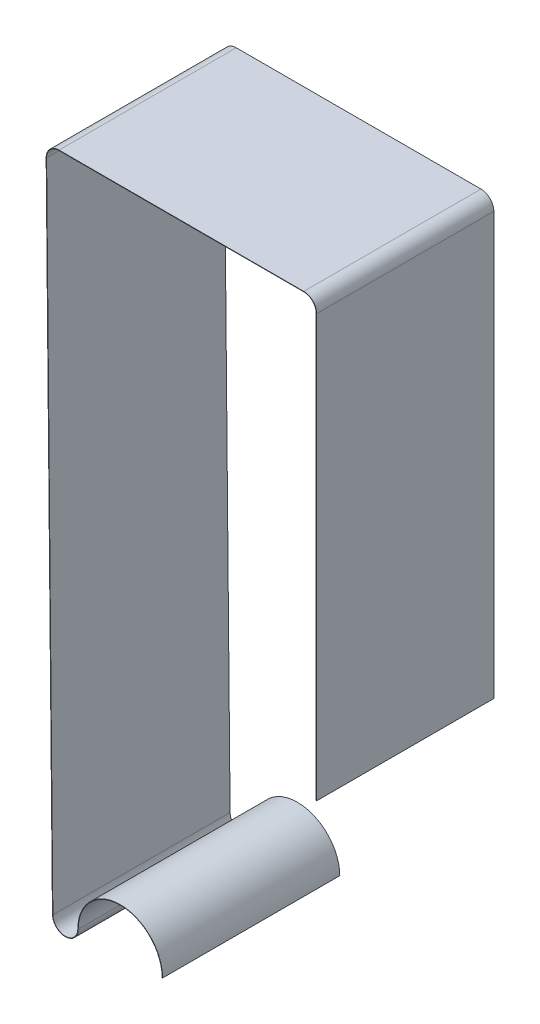
ISO-10303-21;
HEADER;
FILE_DESCRIPTION(('STEP AP214'),'2;1');
FILE_NAME('part.step','',(''),(''),'','','');
FILE_SCHEMA(('AUTOMOTIVE_DESIGN { 1 0 10303 214 1 1 1 1 }'));
ENDSEC;
DATA;
#1=APPLICATION_CONTEXT('core data for automotive mechanical design processes');
#2=APPLICATION_PROTOCOL_DEFINITION('international standard','automotive_design',2000,#1);
#3=PRODUCT_CONTEXT('',#1,'mechanical');
#4=PRODUCT('Part','Part','',(#3));
#5=PRODUCT_RELATED_PRODUCT_CATEGORY('part','',(#4));
#6=PRODUCT_DEFINITION_FORMATION('','',#4);
#7=PRODUCT_DEFINITION_CONTEXT('part definition',#1,'design');
#8=PRODUCT_DEFINITION('design','',#6,#7);
#9=PRODUCT_DEFINITION_SHAPE('','',#8);
#10=(LENGTH_UNIT() NAMED_UNIT(*) SI_UNIT(.MILLI.,.METRE.));
#11=(NAMED_UNIT(*) PLANE_ANGLE_UNIT() SI_UNIT($,.RADIAN.));
#12=(NAMED_UNIT(*) SI_UNIT($,.STERADIAN.) SOLID_ANGLE_UNIT());
#13=UNCERTAINTY_MEASURE_WITH_UNIT(LENGTH_MEASURE(1.E-05),#10,'distance_accuracy_value','');
#14=(GEOMETRIC_REPRESENTATION_CONTEXT(3) GLOBAL_UNCERTAINTY_ASSIGNED_CONTEXT((#13)) GLOBAL_UNIT_ASSIGNED_CONTEXT((#10,
#11,#12)) REPRESENTATION_CONTEXT('',''));
#15=CARTESIAN_POINT('',(0.,0.,0.));
#16=DIRECTION('',(0.,0.,1.));
#17=DIRECTION('',(1.,0.,0.));
#18=AXIS2_PLACEMENT_3D('',#15,#16,#17);
#19=CARTESIAN_POINT('',(0.,1131.07306523991,0.));
#20=DIRECTION('',(0.,-1.,0.));
#21=DIRECTION('',(0.,0.,-1.));
#22=AXIS2_PLACEMENT_3D('',#19,#20,#21);
#23=PLANE('',#22);
#24=DIRECTION('',(0.,0.,-1.));
#25=VECTOR('',#24,1.);
#26=CARTESIAN_POINT('',(5.24999999999983,1131.07306523991,105.));
#27=LINE('',#26,#25);
#28=CARTESIAN_POINT('',(5.24999999999983,1131.07306523991,105.));
#29=VERTEX_POINT('',#28);
#30=CARTESIAN_POINT('',(5.24999999999983,1131.07306523991,-105.));
#31=VERTEX_POINT('',#30);
#32=EDGE_CURVE('E180',#29,#31,#27,.T.);
#33=ORIENTED_EDGE('',*,*,#32,.F.);
#34=DIRECTION('',(1.,0.,0.));
#35=VECTOR('',#34,1.);
#36=CARTESIAN_POINT('',(4.74999999999983,1131.07306523991,105.));
#37=LINE('',#36,#35);
#38=CARTESIAN_POINT('',(4.74999999999983,1131.07306523991,105.));
#39=VERTEX_POINT('',#38);
#40=EDGE_CURVE('E182',#39,#29,#37,.T.);
#41=ORIENTED_EDGE('',*,*,#40,.F.);
#42=DIRECTION('',(0.,0.,1.));
#43=VECTOR('',#42,1.);
#44=CARTESIAN_POINT('',(4.74999999999983,1131.07306523991,105.));
#45=LINE('',#44,#43);
#46=CARTESIAN_POINT('',(4.74999999999983,1131.07306523991,-105.));
#47=VERTEX_POINT('',#46);
#48=EDGE_CURVE('E201',#47,#39,#45,.T.);
#49=ORIENTED_EDGE('',*,*,#48,.F.);
#50=DIRECTION('',(-1.,0.,0.));
#51=VECTOR('',#50,1.);
#52=CARTESIAN_POINT('',(4.74999999999983,1131.07306523991,-105.));
#53=LINE('',#52,#51);
#54=EDGE_CURVE('E185',#31,#47,#53,.T.);
#55=ORIENTED_EDGE('',*,*,#54,.F.);
#56=EDGE_LOOP('',(#33,#41,#49,#55));
#57=FACE_BOUND('',#56,.T.);
#58=ADVANCED_FACE('F47',(#57),#23,.T.);
#59=CARTESIAN_POINT('',(-172.546440075001,858.013196323219,0.));
#60=DIRECTION('',(0.,1.,0.));
#61=DIRECTION('',(0.,0.,-1.));
#62=AXIS2_PLACEMENT_3D('',#59,#60,#61);
#63=PLANE('',#62);
#64=DIRECTION('',(0.,0.,-1.));
#65=VECTOR('',#64,1.);
#66=CARTESIAN_POINT('',(-177.796440075001,858.013196323219,105.));
#67=LINE('',#66,#65);
#68=CARTESIAN_POINT('',(-177.796440075001,858.013196323219,105.));
#69=VERTEX_POINT('',#68);
#70=CARTESIAN_POINT('',(-177.796440075001,858.013196323219,-105.));
#71=VERTEX_POINT('',#70);
#72=EDGE_CURVE('E282',#69,#71,#67,.T.);
#73=ORIENTED_EDGE('',*,*,#72,.T.);
#74=DIRECTION('',(1.,0.,0.));
#75=VECTOR('',#74,1.);
#76=CARTESIAN_POINT('',(-177.296440075001,858.013196323219,-105.));
#77=LINE('',#76,#75);
#78=CARTESIAN_POINT('',(-177.296440075001,858.013196323219,-105.));
#79=VERTEX_POINT('',#78);
#80=EDGE_CURVE('E67',#71,#79,#77,.T.);
#81=ORIENTED_EDGE('',*,*,#80,.T.);
#82=DIRECTION('',(0.,0.,1.));
#83=VECTOR('',#82,1.);
#84=CARTESIAN_POINT('',(-177.296440075001,858.013196323219,105.));
#85=LINE('',#84,#83);
#86=CARTESIAN_POINT('',(-177.296440075001,858.013196323219,105.));
#87=VERTEX_POINT('',#86);
#88=EDGE_CURVE('E61',#79,#87,#85,.T.);
#89=ORIENTED_EDGE('',*,*,#88,.T.);
#90=DIRECTION('',(-1.,0.,0.));
#91=VECTOR('',#90,1.);
#92=CARTESIAN_POINT('',(-177.296440075001,858.013196323219,105.));
#93=LINE('',#92,#91);
#94=EDGE_CURVE('E11',#87,#69,#93,.T.);
#95=ORIENTED_EDGE('',*,*,#94,.T.);
#96=EDGE_LOOP('',(#73,#81,#89,#95));
#97=FACE_BOUND('',#96,.T.);
#98=ADVANCED_FACE('F456',(#97),#63,.F.);
#99=CARTESIAN_POINT('',(5.24999999999983,1131.07306523991,105.));
#100=DIRECTION('',(1.,0.,0.));
#101=DIRECTION('',(0.,1.,0.));
#102=AXIS2_PLACEMENT_3D('',#99,#100,#101);
#103=PLANE('',#102);
#104=DIRECTION('',(0.,1.,0.));
#105=VECTOR('',#104,1.);
#106=CARTESIAN_POINT('',(5.24999999999983,1131.07306523991,-105.));
#107=LINE('',#106,#105);
#108=CARTESIAN_POINT('',(5.24999999999982,1631.07306523991,-105.));
#109=VERTEX_POINT('',#108);
#110=EDGE_CURVE('E210',#31,#109,#107,.T.);
#111=ORIENTED_EDGE('',*,*,#110,.T.);
#112=DIRECTION('',(0.,0.,-1.));
#113=VECTOR('',#112,1.);
#114=CARTESIAN_POINT('',(5.24999999999982,1631.07306523991,105.));
#115=LINE('',#114,#113);
#116=CARTESIAN_POINT('',(5.24999999999982,1631.07306523991,105.));
#117=VERTEX_POINT('',#116);
#118=EDGE_CURVE('E206',#117,#109,#115,.T.);
#119=ORIENTED_EDGE('',*,*,#118,.F.);
#120=DIRECTION('',(0.,1.,0.));
#121=VECTOR('',#120,1.);
#122=CARTESIAN_POINT('',(5.24999999999983,1131.07306523991,105.));
#123=LINE('',#122,#121);
#124=EDGE_CURVE('E197',#29,#117,#123,.T.);
#125=ORIENTED_EDGE('',*,*,#124,.F.);
#126=ORIENTED_EDGE('',*,*,#32,.T.);
#127=EDGE_LOOP('',(#111,#119,#125,#126));
#128=FACE_BOUND('',#127,.T.);
#129=ADVANCED_FACE('F204',(#128),#103,.T.);
#130=CARTESIAN_POINT('',(4.74999999999983,1131.07306523991,-105.));
#131=DIRECTION('',(0.,0.,-1.));
#132=DIRECTION('',(-1.,0.,0.));
#133=AXIS2_PLACEMENT_3D('',#130,#131,#132);
#134=PLANE('',#133);
#135=DIRECTION('',(0.,1.,0.));
#136=VECTOR('',#135,1.);
#137=CARTESIAN_POINT('',(4.74999999999983,1131.07306523991,-105.));
#138=LINE('',#137,#136);
#139=CARTESIAN_POINT('',(4.74999999999982,1631.07306523991,-105.));
#140=VERTEX_POINT('',#139);
#141=EDGE_CURVE('E298',#47,#140,#138,.T.);
#142=ORIENTED_EDGE('',*,*,#141,.T.);
#143=DIRECTION('',(-1.,0.,0.));
#144=VECTOR('',#143,1.);
#145=CARTESIAN_POINT('',(4.74999999999982,1631.07306523991,-105.));
#146=LINE('',#145,#144);
#147=EDGE_CURVE('E294',#109,#140,#146,.T.);
#148=ORIENTED_EDGE('',*,*,#147,.F.);
#149=ORIENTED_EDGE('',*,*,#110,.F.);
#150=ORIENTED_EDGE('',*,*,#54,.T.);
#151=EDGE_LOOP('',(#142,#148,#149,#150));
#152=FACE_BOUND('',#151,.T.);
#153=ADVANCED_FACE('F490',(#152),#134,.T.);
#154=CARTESIAN_POINT('',(4.74999999999983,1131.07306523991,105.));
#155=DIRECTION('',(-1.,0.,0.));
#156=DIRECTION('',(0.,-1.,0.));
#157=AXIS2_PLACEMENT_3D('',#154,#155,#156);
#158=PLANE('',#157);
#159=DIRECTION('',(0.,1.,0.));
#160=VECTOR('',#159,1.);
#161=CARTESIAN_POINT('',(4.74999999999983,1131.07306523991,105.));
#162=LINE('',#161,#160);
#163=CARTESIAN_POINT('',(4.74999999999982,1631.07306523991,105.));
#164=VERTEX_POINT('',#163);
#165=EDGE_CURVE('E199',#39,#164,#162,.T.);
#166=ORIENTED_EDGE('',*,*,#165,.T.);
#167=DIRECTION('',(0.,0.,1.));
#168=VECTOR('',#167,1.);
#169=CARTESIAN_POINT('',(4.74999999999982,1631.07306523991,105.));
#170=LINE('',#169,#168);
#171=EDGE_CURVE('E302',#140,#164,#170,.T.);
#172=ORIENTED_EDGE('',*,*,#171,.F.);
#173=ORIENTED_EDGE('',*,*,#141,.F.);
#174=ORIENTED_EDGE('',*,*,#48,.T.);
#175=EDGE_LOOP('',(#166,#172,#173,#174));
#176=FACE_BOUND('',#175,.T.);
#177=ADVANCED_FACE('F435',(#176),#158,.T.);
#178=CARTESIAN_POINT('',(4.74999999999983,1131.07306523991,105.));
#179=DIRECTION('',(0.,0.,1.));
#180=DIRECTION('',(1.,0.,0.));
#181=AXIS2_PLACEMENT_3D('',#178,#179,#180);
#182=PLANE('',#181);
#183=DIRECTION('',(1.,0.,0.));
#184=VECTOR('',#183,1.);
#185=CARTESIAN_POINT('',(4.74999999999982,1631.07306523991,105.));
#186=LINE('',#185,#184);
#187=EDGE_CURVE('E227',#164,#117,#186,.T.);
#188=ORIENTED_EDGE('',*,*,#187,.F.);
#189=ORIENTED_EDGE('',*,*,#165,.F.);
#190=ORIENTED_EDGE('',*,*,#40,.T.);
#191=ORIENTED_EDGE('',*,*,#124,.T.);
#192=EDGE_LOOP('',(#188,#189,#190,#191));
#193=FACE_BOUND('',#192,.T.);
#194=ADVANCED_FACE('F196',(#193),#182,.T.);
#195=CARTESIAN_POINT('',(-10.0000000000001,1631.07306523991,0.));
#196=DIRECTION('',(0.,0.,1.));
#197=DIRECTION('',(1.,0.,0.));
#198=AXIS2_PLACEMENT_3D('',#195,#196,#197);
#199=CYLINDRICAL_SURFACE('',#198,15.2500000000167);
#200=CARTESIAN_POINT('',(-10.0000000000001,1631.07306523991,-105.));
#201=DIRECTION('',(0.,0.,1.));
#202=DIRECTION('',(1.,0.,0.));
#203=AXIS2_PLACEMENT_3D('',#200,#201,#202);
#204=CIRCLE('',#203,15.2500000000167);
#205=CARTESIAN_POINT('',(-10.0000000000002,1646.32306523992,-105.));
#206=VERTEX_POINT('',#205);
#207=EDGE_CURVE('E218',#109,#206,#204,.T.);
#208=ORIENTED_EDGE('',*,*,#207,.T.);
#209=DIRECTION('',(0.,0.,-1.));
#210=VECTOR('',#209,1.);
#211=CARTESIAN_POINT('',(-10.0000000000002,1646.32306523991,105.));
#212=LINE('',#211,#210);
#213=CARTESIAN_POINT('',(-10.0000000000002,1646.32306523992,105.));
#214=VERTEX_POINT('',#213);
#215=EDGE_CURVE('E214',#214,#206,#212,.T.);
#216=ORIENTED_EDGE('',*,*,#215,.F.);
#217=CARTESIAN_POINT('',(-10.0000000000001,1631.07306523991,105.));
#218=DIRECTION('',(0.,0.,1.));
#219=DIRECTION('',(1.,0.,0.));
#220=AXIS2_PLACEMENT_3D('',#217,#218,#219);
#221=CIRCLE('',#220,15.2500000000167);
#222=EDGE_CURVE('E219',#117,#214,#221,.T.);
#223=ORIENTED_EDGE('',*,*,#222,.F.);
#224=ORIENTED_EDGE('',*,*,#118,.T.);
#225=EDGE_LOOP('',(#208,#216,#223,#224));
#226=FACE_BOUND('',#225,.T.);
#227=ADVANCED_FACE('F431',(#226),#199,.T.);
#228=CARTESIAN_POINT('',(4.75000000001667,1631.07306523991,-105.));
#229=DIRECTION('',(0.,0.,-1.));
#230=DIRECTION('',(-1.,0.,0.));
#231=AXIS2_PLACEMENT_3D('',#228,#229,#230);
#232=PLANE('',#231);
#233=CARTESIAN_POINT('',(-10.0000000000001,1631.07306523991,-105.));
#234=DIRECTION('',(0.,0.,1.));
#235=DIRECTION('',(1.,0.,0.));
#236=AXIS2_PLACEMENT_3D('',#233,#234,#235);
#237=CIRCLE('',#236,14.7500000000167);
#238=CARTESIAN_POINT('',(-10.0000000000002,1645.82306523992,-105.));
#239=VERTEX_POINT('',#238);
#240=EDGE_CURVE('E306',#140,#239,#237,.T.);
#241=ORIENTED_EDGE('',*,*,#240,.T.);
#242=DIRECTION('',(0.,-1.,0.));
#243=VECTOR('',#242,1.);
#244=CARTESIAN_POINT('',(-10.0000000000002,1645.82306523991,-105.));
#245=LINE('',#244,#243);
#246=EDGE_CURVE('E223',#206,#239,#245,.T.);
#247=ORIENTED_EDGE('',*,*,#246,.F.);
#248=ORIENTED_EDGE('',*,*,#207,.F.);
#249=ORIENTED_EDGE('',*,*,#147,.T.);
#250=EDGE_LOOP('',(#241,#247,#248,#249));
#251=FACE_BOUND('',#250,.T.);
#252=ADVANCED_FACE('F442',(#251),#232,.T.);
#253=CARTESIAN_POINT('',(-10.0000000000001,1631.07306523991,0.));
#254=DIRECTION('',(0.,0.,1.));
#255=DIRECTION('',(1.,0.,0.));
#256=AXIS2_PLACEMENT_3D('',#253,#254,#255);
#257=CYLINDRICAL_SURFACE('',#256,14.7500000000167);
#258=CARTESIAN_POINT('',(-10.0000000000001,1631.07306523991,105.));
#259=DIRECTION('',(0.,0.,1.));
#260=DIRECTION('',(1.,0.,0.));
#261=AXIS2_PLACEMENT_3D('',#258,#259,#260);
#262=CIRCLE('',#261,14.7500000000167);
#263=CARTESIAN_POINT('',(-10.0000000000002,1645.82306523992,105.));
#264=VERTEX_POINT('',#263);
#265=EDGE_CURVE('E353',#164,#264,#262,.T.);
#266=ORIENTED_EDGE('',*,*,#265,.T.);
#267=DIRECTION('',(0.,0.,1.));
#268=VECTOR('',#267,1.);
#269=CARTESIAN_POINT('',(-10.0000000000002,1645.82306523991,105.));
#270=LINE('',#269,#268);
#271=EDGE_CURVE('E310',#239,#264,#270,.T.);
#272=ORIENTED_EDGE('',*,*,#271,.F.);
#273=ORIENTED_EDGE('',*,*,#240,.F.);
#274=ORIENTED_EDGE('',*,*,#171,.T.);
#275=EDGE_LOOP('',(#266,#272,#273,#274));
#276=FACE_BOUND('',#275,.T.);
#277=ADVANCED_FACE('F438',(#276),#257,.F.);
#278=CARTESIAN_POINT('',(4.75000000001667,1631.07306523991,105.));
#279=DIRECTION('',(0.,0.,1.));
#280=DIRECTION('',(1.,0.,0.));
#281=AXIS2_PLACEMENT_3D('',#278,#279,#280);
#282=PLANE('',#281);
#283=DIRECTION('',(0.,1.,0.));
#284=VECTOR('',#283,1.);
#285=CARTESIAN_POINT('',(-10.0000000000002,1645.82306523991,105.));
#286=LINE('',#285,#284);
#287=EDGE_CURVE('E241',#264,#214,#286,.T.);
#288=ORIENTED_EDGE('',*,*,#287,.F.);
#289=ORIENTED_EDGE('',*,*,#265,.F.);
#290=ORIENTED_EDGE('',*,*,#187,.T.);
#291=ORIENTED_EDGE('',*,*,#222,.T.);
#292=EDGE_LOOP('',(#288,#289,#290,#291));
#293=FACE_BOUND('',#292,.T.);
#294=ADVANCED_FACE('F432',(#293),#282,.T.);
#295=CARTESIAN_POINT('',(-10.0000000000002,1646.32306523991,105.));
#296=DIRECTION('',(0.,1.,0.));
#297=DIRECTION('',(-1.,0.,0.));
#298=AXIS2_PLACEMENT_3D('',#295,#296,#297);
#299=PLANE('',#298);
#300=DIRECTION('',(-1.,0.,0.));
#301=VECTOR('',#300,1.);
#302=CARTESIAN_POINT('',(-10.0000000000002,1646.32306523991,-105.));
#303=LINE('',#302,#301);
#304=CARTESIAN_POINT('',(-300.,1646.32306523991,-105.));
#305=VERTEX_POINT('',#304);
#306=EDGE_CURVE('E232',#206,#305,#303,.T.);
#307=ORIENTED_EDGE('',*,*,#306,.T.);
#308=DIRECTION('',(0.,0.,-1.));
#309=VECTOR('',#308,1.);
#310=CARTESIAN_POINT('',(-300.,1646.32306523991,105.));
#311=LINE('',#310,#309);
#312=CARTESIAN_POINT('',(-300.,1646.32306523991,105.));
#313=VERTEX_POINT('',#312);
#314=EDGE_CURVE('E228',#313,#305,#311,.T.);
#315=ORIENTED_EDGE('',*,*,#314,.F.);
#316=DIRECTION('',(-1.,0.,0.));
#317=VECTOR('',#316,1.);
#318=CARTESIAN_POINT('',(-10.0000000000002,1646.32306523991,105.));
#319=LINE('',#318,#317);
#320=EDGE_CURVE('E233',#214,#313,#319,.T.);
#321=ORIENTED_EDGE('',*,*,#320,.F.);
#322=ORIENTED_EDGE('',*,*,#215,.T.);
#323=EDGE_LOOP('',(#307,#315,#321,#322));
#324=FACE_BOUND('',#323,.T.);
#325=ADVANCED_FACE('F425',(#324),#299,.T.);
#326=CARTESIAN_POINT('',(-10.0000000000002,1645.82306523991,-105.));
#327=DIRECTION('',(0.,0.,-1.));
#328=DIRECTION('',(-1.,0.,0.));
#329=AXIS2_PLACEMENT_3D('',#326,#327,#328);
#330=PLANE('',#329);
#331=DIRECTION('',(-1.,0.,0.));
#332=VECTOR('',#331,1.);
#333=CARTESIAN_POINT('',(-10.0000000000002,1645.82306523991,-105.));
#334=LINE('',#333,#332);
#335=CARTESIAN_POINT('',(-300.,1645.82306523991,-105.));
#336=VERTEX_POINT('',#335);
#337=EDGE_CURVE('E314',#239,#336,#334,.T.);
#338=ORIENTED_EDGE('',*,*,#337,.T.);
#339=DIRECTION('',(0.,-1.,0.));
#340=VECTOR('',#339,1.);
#341=CARTESIAN_POINT('',(-300.,1645.82306523991,-105.));
#342=LINE('',#341,#340);
#343=EDGE_CURVE('E237',#305,#336,#342,.T.);
#344=ORIENTED_EDGE('',*,*,#343,.F.);
#345=ORIENTED_EDGE('',*,*,#306,.F.);
#346=ORIENTED_EDGE('',*,*,#246,.T.);
#347=EDGE_LOOP('',(#338,#344,#345,#346));
#348=FACE_BOUND('',#347,.T.);
#349=ADVANCED_FACE('F445',(#348),#330,.T.);
#350=CARTESIAN_POINT('',(-10.0000000000002,1645.82306523991,105.));
#351=DIRECTION('',(0.,-1.,0.));
#352=DIRECTION('',(1.,0.,0.));
#353=AXIS2_PLACEMENT_3D('',#350,#351,#352);
#354=PLANE('',#353);
#355=DIRECTION('',(-1.,0.,0.));
#356=VECTOR('',#355,1.);
#357=CARTESIAN_POINT('',(-10.0000000000002,1645.82306523991,105.));
#358=LINE('',#357,#356);
#359=CARTESIAN_POINT('',(-300.,1645.82306523991,105.));
#360=VERTEX_POINT('',#359);
#361=EDGE_CURVE('E360',#264,#360,#358,.T.);
#362=ORIENTED_EDGE('',*,*,#361,.T.);
#363=DIRECTION('',(0.,0.,1.));
#364=VECTOR('',#363,1.);
#365=CARTESIAN_POINT('',(-300.,1645.82306523991,105.));
#366=LINE('',#365,#364);
#367=EDGE_CURVE('E318',#336,#360,#366,.T.);
#368=ORIENTED_EDGE('',*,*,#367,.F.);
#369=ORIENTED_EDGE('',*,*,#337,.F.);
#370=ORIENTED_EDGE('',*,*,#271,.T.);
#371=EDGE_LOOP('',(#362,#368,#369,#370));
#372=FACE_BOUND('',#371,.T.);
#373=ADVANCED_FACE('F466',(#372),#354,.T.);
#374=CARTESIAN_POINT('',(-10.0000000000002,1645.82306523991,105.));
#375=DIRECTION('',(0.,0.,1.));
#376=DIRECTION('',(1.,0.,0.));
#377=AXIS2_PLACEMENT_3D('',#374,#375,#376);
#378=PLANE('',#377);
#379=DIRECTION('',(0.,1.,0.));
#380=VECTOR('',#379,1.);
#381=CARTESIAN_POINT('',(-300.,1645.82306523991,105.));
#382=LINE('',#381,#380);
#383=EDGE_CURVE('E255',#360,#313,#382,.T.);
#384=ORIENTED_EDGE('',*,*,#383,.F.);
#385=ORIENTED_EDGE('',*,*,#361,.F.);
#386=ORIENTED_EDGE('',*,*,#287,.T.);
#387=ORIENTED_EDGE('',*,*,#320,.T.);
#388=EDGE_LOOP('',(#384,#385,#386,#387));
#389=FACE_BOUND('',#388,.T.);
#390=ADVANCED_FACE('F426',(#389),#378,.T.);
#391=CARTESIAN_POINT('',(-300.,1631.07306523991,0.));
#392=DIRECTION('',(0.,0.,1.));
#393=DIRECTION('',(1.,0.,0.));
#394=AXIS2_PLACEMENT_3D('',#391,#392,#393);
#395=CYLINDRICAL_SURFACE('',#394,15.2499999999998);
#396=CARTESIAN_POINT('',(-300.,1631.07306523991,-105.));
#397=DIRECTION('',(0.,0.,1.));
#398=DIRECTION('',(0.,1.,0.));
#399=AXIS2_PLACEMENT_3D('',#396,#397,#398);
#400=CIRCLE('',#399,15.2499999999998);
#401=CARTESIAN_POINT('',(-315.249291221056,1630.92603716291,-105.));
#402=VERTEX_POINT('',#401);
#403=EDGE_CURVE('E246',#305,#402,#400,.T.);
#404=ORIENTED_EDGE('',*,*,#403,.T.);
#405=DIRECTION('',(0.,0.,-1.));
#406=VECTOR('',#405,1.);
#407=CARTESIAN_POINT('',(-315.249291221056,1630.92603716291,105.));
#408=LINE('',#407,#406);
#409=CARTESIAN_POINT('',(-315.249291221056,1630.92603716291,105.));
#410=VERTEX_POINT('',#409);
#411=EDGE_CURVE('E242',#410,#402,#408,.T.);
#412=ORIENTED_EDGE('',*,*,#411,.F.);
#413=CARTESIAN_POINT('',(-300.,1631.07306523991,105.));
#414=DIRECTION('',(0.,0.,1.));
#415=DIRECTION('',(0.,1.,0.));
#416=AXIS2_PLACEMENT_3D('',#413,#414,#415);
#417=CIRCLE('',#416,15.2499999999998);
#418=EDGE_CURVE('E247',#313,#410,#417,.T.);
#419=ORIENTED_EDGE('',*,*,#418,.F.);
#420=ORIENTED_EDGE('',*,*,#314,.T.);
#421=EDGE_LOOP('',(#404,#412,#419,#420));
#422=FACE_BOUND('',#421,.T.);
#423=ADVANCED_FACE('F419',(#422),#395,.T.);
#424=CARTESIAN_POINT('',(-300.,1645.82306523991,-105.));
#425=DIRECTION('',(0.,0.,-1.));
#426=DIRECTION('',(-1.,0.,0.));
#427=AXIS2_PLACEMENT_3D('',#424,#425,#426);
#428=PLANE('',#427);
#429=CARTESIAN_POINT('',(-300.,1631.07306523991,-105.));
#430=DIRECTION('',(0.,0.,1.));
#431=DIRECTION('',(0.,1.,0.));
#432=AXIS2_PLACEMENT_3D('',#429,#430,#431);
#433=CIRCLE('',#432,14.7499999999998);
#434=CARTESIAN_POINT('',(-314.74931445971,1630.9308577556,-105.));
#435=VERTEX_POINT('',#434);
#436=EDGE_CURVE('E322',#336,#435,#433,.T.);
#437=ORIENTED_EDGE('',*,*,#436,.T.);
#438=DIRECTION('',(0.999953522692195,0.00964118537682227,0.));
#439=VECTOR('',#438,1.);
#440=CARTESIAN_POINT('',(-314.74931445971,1630.9308577556,-105.));
#441=LINE('',#440,#439);
#442=EDGE_CURVE('E251',#402,#435,#441,.T.);
#443=ORIENTED_EDGE('',*,*,#442,.F.);
#444=ORIENTED_EDGE('',*,*,#403,.F.);
#445=ORIENTED_EDGE('',*,*,#343,.T.);
#446=EDGE_LOOP('',(#437,#443,#444,#445));
#447=FACE_BOUND('',#446,.T.);
#448=ADVANCED_FACE('F448',(#447),#428,.T.);
#449=CARTESIAN_POINT('',(-300.,1631.07306523991,0.));
#450=DIRECTION('',(0.,0.,1.));
#451=DIRECTION('',(1.,0.,0.));
#452=AXIS2_PLACEMENT_3D('',#449,#450,#451);
#453=CYLINDRICAL_SURFACE('',#452,14.7499999999998);
#454=CARTESIAN_POINT('',(-300.,1631.07306523991,105.));
#455=DIRECTION('',(0.,0.,1.));
#456=DIRECTION('',(0.,1.,0.));
#457=AXIS2_PLACEMENT_3D('',#454,#455,#456);
#458=CIRCLE('',#457,14.7499999999998);
#459=CARTESIAN_POINT('',(-314.74931445971,1630.9308577556,105.));
#460=VERTEX_POINT('',#459);
#461=EDGE_CURVE('E367',#360,#460,#458,.T.);
#462=ORIENTED_EDGE('',*,*,#461,.T.);
#463=DIRECTION('',(0.,0.,1.));
#464=VECTOR('',#463,1.);
#465=CARTESIAN_POINT('',(-314.74931445971,1630.9308577556,105.));
#466=LINE('',#465,#464);
#467=EDGE_CURVE('E326',#435,#460,#466,.T.);
#468=ORIENTED_EDGE('',*,*,#467,.F.);
#469=ORIENTED_EDGE('',*,*,#436,.F.);
#470=ORIENTED_EDGE('',*,*,#367,.T.);
#471=EDGE_LOOP('',(#462,#468,#469,#470));
#472=FACE_BOUND('',#471,.T.);
#473=ADVANCED_FACE('F463',(#472),#453,.F.);
#474=CARTESIAN_POINT('',(-300.,1645.82306523991,105.));
#475=DIRECTION('',(0.,0.,1.));
#476=DIRECTION('',(1.,0.,0.));
#477=AXIS2_PLACEMENT_3D('',#474,#475,#476);
#478=PLANE('',#477);
#479=DIRECTION('',(-0.999953522692195,-0.00964118537682227,0.));
#480=VECTOR('',#479,1.);
#481=CARTESIAN_POINT('',(-314.74931445971,1630.9308577556,105.));
#482=LINE('',#481,#480);
#483=EDGE_CURVE('E269',#460,#410,#482,.T.);
#484=ORIENTED_EDGE('',*,*,#483,.F.);
#485=ORIENTED_EDGE('',*,*,#461,.F.);
#486=ORIENTED_EDGE('',*,*,#383,.T.);
#487=ORIENTED_EDGE('',*,*,#418,.T.);
#488=EDGE_LOOP('',(#484,#485,#486,#487));
#489=FACE_BOUND('',#488,.T.);
#490=ADVANCED_FACE('F420',(#489),#478,.T.);
#491=CARTESIAN_POINT('',(-315.249291221056,1630.92603716291,105.));
#492=DIRECTION('',(-0.999953522692195,-0.0096411853768127,0.));
#493=DIRECTION('',(0.0096411853768127,-0.999953522692195,0.));
#494=AXIS2_PLACEMENT_3D('',#491,#492,#493);
#495=PLANE('',#494);
#496=DIRECTION('',(0.0096411853768127,-0.999953522692195,0.));
#497=VECTOR('',#496,1.);
#498=CARTESIAN_POINT('',(-315.249291221056,1630.92603716291,-105.));
#499=LINE('',#498,#497);
#500=CARTESIAN_POINT('',(-307.795731296057,857.866168246223,-105.));
#501=VERTEX_POINT('',#500);
#502=EDGE_CURVE('E260',#402,#501,#499,.T.);
#503=ORIENTED_EDGE('',*,*,#502,.T.);
#504=DIRECTION('',(0.,0.,-1.));
#505=VECTOR('',#504,1.);
#506=CARTESIAN_POINT('',(-307.795731296057,857.866168246223,105.));
#507=LINE('',#506,#505);
#508=CARTESIAN_POINT('',(-307.795731296057,857.866168246223,105.));
#509=VERTEX_POINT('',#508);
#510=EDGE_CURVE('E256',#509,#501,#507,.T.);
#511=ORIENTED_EDGE('',*,*,#510,.F.);
#512=DIRECTION('',(0.0096411853768127,-0.999953522692195,0.));
#513=VECTOR('',#512,1.);
#514=CARTESIAN_POINT('',(-315.249291221056,1630.92603716291,105.));
#515=LINE('',#514,#513);
#516=EDGE_CURVE('E261',#410,#509,#515,.T.);
#517=ORIENTED_EDGE('',*,*,#516,.F.);
#518=ORIENTED_EDGE('',*,*,#411,.T.);
#519=EDGE_LOOP('',(#503,#511,#517,#518));
#520=FACE_BOUND('',#519,.T.);
#521=ADVANCED_FACE('F413',(#520),#495,.T.);
#522=CARTESIAN_POINT('',(-314.74931445971,1630.9308577556,-105.));
#523=DIRECTION('',(0.,0.,-1.));
#524=DIRECTION('',(-1.,0.,0.));
#525=AXIS2_PLACEMENT_3D('',#522,#523,#524);
#526=PLANE('',#525);
#527=DIRECTION('',(0.0096411853768127,-0.999953522692195,0.));
#528=VECTOR('',#527,1.);
#529=CARTESIAN_POINT('',(-314.74931445971,1630.9308577556,-105.));
#530=LINE('',#529,#528);
#531=CARTESIAN_POINT('',(-307.295754534711,857.870988838911,-105.));
#532=VERTEX_POINT('',#531);
#533=EDGE_CURVE('E329',#435,#532,#530,.T.);
#534=ORIENTED_EDGE('',*,*,#533,.T.);
#535=DIRECTION('',(0.999953522692195,0.00964118537681269,0.));
#536=VECTOR('',#535,1.);
#537=CARTESIAN_POINT('',(-307.295754534711,857.870988838911,-105.));
#538=LINE('',#537,#536);
#539=EDGE_CURVE('E265',#501,#532,#538,.T.);
#540=ORIENTED_EDGE('',*,*,#539,.F.);
#541=ORIENTED_EDGE('',*,*,#502,.F.);
#542=ORIENTED_EDGE('',*,*,#442,.T.);
#543=EDGE_LOOP('',(#534,#540,#541,#542));
#544=FACE_BOUND('',#543,.T.);
#545=ADVANCED_FACE('F451',(#544),#526,.T.);
#546=CARTESIAN_POINT('',(-314.74931445971,1630.9308577556,105.));
#547=DIRECTION('',(0.999953522692195,0.0096411853768127,0.));
#548=DIRECTION('',(-0.0096411853768127,0.999953522692195,0.));
#549=AXIS2_PLACEMENT_3D('',#546,#547,#548);
#550=PLANE('',#549);
#551=DIRECTION('',(0.0096411853768127,-0.999953522692195,0.));
#552=VECTOR('',#551,1.);
#553=CARTESIAN_POINT('',(-314.74931445971,1630.9308577556,105.));
#554=LINE('',#553,#552);
#555=CARTESIAN_POINT('',(-307.295754534711,857.870988838911,105.));
#556=VERTEX_POINT('',#555);
#557=EDGE_CURVE('E373',#460,#556,#554,.T.);
#558=ORIENTED_EDGE('',*,*,#557,.T.);
#559=DIRECTION('',(0.,0.,1.));
#560=VECTOR('',#559,1.);
#561=CARTESIAN_POINT('',(-307.295754534711,857.870988838911,105.));
#562=LINE('',#561,#560);
#563=EDGE_CURVE('E333',#532,#556,#562,.T.);
#564=ORIENTED_EDGE('',*,*,#563,.F.);
#565=ORIENTED_EDGE('',*,*,#533,.F.);
#566=ORIENTED_EDGE('',*,*,#467,.T.);
#567=EDGE_LOOP('',(#558,#564,#565,#566));
#568=FACE_BOUND('',#567,.T.);
#569=ADVANCED_FACE('F460',(#568),#550,.T.);
#570=CARTESIAN_POINT('',(-314.74931445971,1630.9308577556,105.));
#571=DIRECTION('',(0.,0.,1.));
#572=DIRECTION('',(1.,0.,0.));
#573=AXIS2_PLACEMENT_3D('',#570,#571,#572);
#574=PLANE('',#573);
#575=DIRECTION('',(-0.999953522692195,-0.00964118537681269,0.));
#576=VECTOR('',#575,1.);
#577=CARTESIAN_POINT('',(-307.295754534711,857.870988838911,105.));
#578=LINE('',#577,#576);
#579=EDGE_CURVE('E281',#556,#509,#578,.T.);
#580=ORIENTED_EDGE('',*,*,#579,.F.);
#581=ORIENTED_EDGE('',*,*,#557,.F.);
#582=ORIENTED_EDGE('',*,*,#483,.T.);
#583=ORIENTED_EDGE('',*,*,#516,.T.);
#584=EDGE_LOOP('',(#580,#581,#582,#583));
#585=FACE_BOUND('',#584,.T.);
#586=ADVANCED_FACE('F414',(#585),#574,.T.);
#587=CARTESIAN_POINT('',(-292.546440075001,858.013196323219,0.));
#588=DIRECTION('',(0.,0.,1.));
#589=DIRECTION('',(1.,0.,0.));
#590=AXIS2_PLACEMENT_3D('',#587,#588,#589);
#591=CYLINDRICAL_SURFACE('',#590,15.25);
#592=CARTESIAN_POINT('',(-292.546440075001,858.013196323219,-105.));
#593=DIRECTION('',(0.,0.,1.));
#594=DIRECTION('',(-0.999953522692195,-0.00964118537682783,0.));
#595=AXIS2_PLACEMENT_3D('',#592,#593,#594);
#596=CIRCLE('',#595,15.25);
#597=CARTESIAN_POINT('',(-277.296440075001,858.013196323219,-105.));
#598=VERTEX_POINT('',#597);
#599=EDGE_CURVE('E153',#501,#598,#596,.T.);
#600=ORIENTED_EDGE('',*,*,#599,.T.);
#601=DIRECTION('',(0.,0.,-1.));
#602=VECTOR('',#601,1.);
#603=CARTESIAN_POINT('',(-277.296440075001,858.013196323219,105.));
#604=LINE('',#603,#602);
#605=CARTESIAN_POINT('',(-277.296440075001,858.013196323219,105.));
#606=VERTEX_POINT('',#605);
#607=EDGE_CURVE('E270',#606,#598,#604,.T.);
#608=ORIENTED_EDGE('',*,*,#607,.F.);
#609=CARTESIAN_POINT('',(-292.546440075001,858.013196323219,105.));
#610=DIRECTION('',(0.,0.,1.));
#611=DIRECTION('',(-0.999953522692195,-0.00964118537682783,0.));
#612=AXIS2_PLACEMENT_3D('',#609,#610,#611);
#613=CIRCLE('',#612,15.25);
#614=EDGE_CURVE('E274',#509,#606,#613,.T.);
#615=ORIENTED_EDGE('',*,*,#614,.F.);
#616=ORIENTED_EDGE('',*,*,#510,.T.);
#617=EDGE_LOOP('',(#600,#608,#615,#616));
#618=FACE_BOUND('',#617,.T.);
#619=ADVANCED_FACE('F406',(#618),#591,.T.);
#620=CARTESIAN_POINT('',(-307.295754534711,857.87098883891,-105.));
#621=DIRECTION('',(0.,0.,-1.));
#622=DIRECTION('',(-1.,0.,0.));
#623=AXIS2_PLACEMENT_3D('',#620,#621,#622);
#624=PLANE('',#623);
#625=CARTESIAN_POINT('',(-292.546440075001,858.013196323219,-105.));
#626=DIRECTION('',(0.,0.,1.));
#627=DIRECTION('',(-0.999953522692195,-0.00964118537683154,0.));
#628=AXIS2_PLACEMENT_3D('',#625,#626,#627);
#629=CIRCLE('',#628,14.75);
#630=CARTESIAN_POINT('',(-277.796440075001,858.013196323219,-105.));
#631=VERTEX_POINT('',#630);
#632=EDGE_CURVE('E147',#532,#631,#629,.T.);
#633=ORIENTED_EDGE('',*,*,#632,.T.);
#634=DIRECTION('',(-1.,0.,0.));
#635=VECTOR('',#634,1.);
#636=CARTESIAN_POINT('',(-277.796440075001,858.013196323219,-105.));
#637=LINE('',#636,#635);
#638=EDGE_CURVE('E277',#598,#631,#637,.T.);
#639=ORIENTED_EDGE('',*,*,#638,.F.);
#640=ORIENTED_EDGE('',*,*,#599,.F.);
#641=ORIENTED_EDGE('',*,*,#539,.T.);
#642=EDGE_LOOP('',(#633,#639,#640,#641));
#643=FACE_BOUND('',#642,.T.);
#644=ADVANCED_FACE('F452',(#643),#624,.T.);
#645=CARTESIAN_POINT('',(-292.546440075001,858.013196323219,0.));
#646=DIRECTION('',(0.,0.,1.));
#647=DIRECTION('',(1.,0.,0.));
#648=AXIS2_PLACEMENT_3D('',#645,#646,#647);
#649=CYLINDRICAL_SURFACE('',#648,14.75);
#650=CARTESIAN_POINT('',(-292.546440075001,858.013196323219,105.));
#651=DIRECTION('',(0.,0.,1.));
#652=DIRECTION('',(-0.999953522692195,-0.00964118537683154,0.));
#653=AXIS2_PLACEMENT_3D('',#650,#651,#652);
#654=CIRCLE('',#653,14.75);
#655=CARTESIAN_POINT('',(-277.796440075001,858.013196323219,105.));
#656=VERTEX_POINT('',#655);
#657=EDGE_CURVE('E379',#556,#656,#654,.T.);
#658=ORIENTED_EDGE('',*,*,#657,.T.);
#659=DIRECTION('',(0.,0.,1.));
#660=VECTOR('',#659,1.);
#661=CARTESIAN_POINT('',(-277.796440075001,858.013196323219,105.));
#662=LINE('',#661,#660);
#663=EDGE_CURVE('E338',#631,#656,#662,.T.);
#664=ORIENTED_EDGE('',*,*,#663,.F.);
#665=ORIENTED_EDGE('',*,*,#632,.F.);
#666=ORIENTED_EDGE('',*,*,#563,.T.);
#667=EDGE_LOOP('',(#658,#664,#665,#666));
#668=FACE_BOUND('',#667,.T.);
#669=ADVANCED_FACE('F458',(#668),#649,.F.);
#670=CARTESIAN_POINT('',(-307.295754534711,857.87098883891,105.));
#671=DIRECTION('',(0.,0.,1.));
#672=DIRECTION('',(1.,0.,0.));
#673=AXIS2_PLACEMENT_3D('',#670,#671,#672);
#674=PLANE('',#673);
#675=DIRECTION('',(1.,0.,0.));
#676=VECTOR('',#675,1.);
#677=CARTESIAN_POINT('',(-277.796440075001,858.013196323219,105.));
#678=LINE('',#677,#676);
#679=EDGE_CURVE('E291',#656,#606,#678,.T.);
#680=ORIENTED_EDGE('',*,*,#679,.F.);
#681=ORIENTED_EDGE('',*,*,#657,.F.);
#682=ORIENTED_EDGE('',*,*,#579,.T.);
#683=ORIENTED_EDGE('',*,*,#614,.T.);
#684=EDGE_LOOP('',(#680,#681,#682,#683));
#685=FACE_BOUND('',#684,.T.);
#686=ADVANCED_FACE('F408',(#685),#674,.T.);
#687=CARTESIAN_POINT('',(-227.546440075001,858.013196323219,0.));
#688=DIRECTION('',(0.,0.,-1.));
#689=DIRECTION('',(-1.,0.,0.));
#690=AXIS2_PLACEMENT_3D('',#687,#688,#689);
#691=CYLINDRICAL_SURFACE('',#690,49.75);
#692=CARTESIAN_POINT('',(-227.546440075001,858.013196323219,-105.));
#693=DIRECTION('',(0.,0.,-1.));
#694=DIRECTION('',(-1.,0.,0.));
#695=AXIS2_PLACEMENT_3D('',#692,#693,#694);
#696=CIRCLE('',#695,49.75);
#697=EDGE_CURVE('E122',#598,#71,#696,.T.);
#698=ORIENTED_EDGE('',*,*,#697,.T.);
#699=ORIENTED_EDGE('',*,*,#72,.F.);
#700=CARTESIAN_POINT('',(-227.546440075001,858.013196323219,105.));
#701=DIRECTION('',(0.,0.,-1.));
#702=DIRECTION('',(-1.,0.,0.));
#703=AXIS2_PLACEMENT_3D('',#700,#701,#702);
#704=CIRCLE('',#703,49.75);
#705=EDGE_CURVE('E285',#606,#69,#704,.T.);
#706=ORIENTED_EDGE('',*,*,#705,.F.);
#707=ORIENTED_EDGE('',*,*,#607,.T.);
#708=EDGE_LOOP('',(#698,#699,#706,#707));
#709=FACE_BOUND('',#708,.T.);
#710=ADVANCED_FACE('F455',(#709),#691,.F.);
#711=CARTESIAN_POINT('',(-277.796440075001,858.013196323219,-105.));
#712=DIRECTION('',(0.,0.,-1.));
#713=DIRECTION('',(-1.,0.,0.));
#714=AXIS2_PLACEMENT_3D('',#711,#712,#713);
#715=PLANE('',#714);
#716=CARTESIAN_POINT('',(-227.546440075001,858.013196323219,-105.));
#717=DIRECTION('',(0.,0.,-1.));
#718=DIRECTION('',(-1.,0.,0.));
#719=AXIS2_PLACEMENT_3D('',#716,#717,#718);
#720=CIRCLE('',#719,50.25);
#721=EDGE_CURVE('E115',#631,#79,#720,.T.);
#722=ORIENTED_EDGE('',*,*,#721,.T.);
#723=ORIENTED_EDGE('',*,*,#80,.F.);
#724=ORIENTED_EDGE('',*,*,#697,.F.);
#725=ORIENTED_EDGE('',*,*,#638,.T.);
#726=EDGE_LOOP('',(#722,#723,#724,#725));
#727=FACE_BOUND('',#726,.T.);
#728=ADVANCED_FACE('F453',(#727),#715,.T.);
#729=CARTESIAN_POINT('',(-227.546440075001,858.013196323219,0.));
#730=DIRECTION('',(0.,0.,-1.));
#731=DIRECTION('',(-1.,0.,0.));
#732=AXIS2_PLACEMENT_3D('',#729,#730,#731);
#733=CYLINDRICAL_SURFACE('',#732,50.25);
#734=CARTESIAN_POINT('',(-227.546440075001,858.013196323219,105.));
#735=DIRECTION('',(0.,0.,-1.));
#736=DIRECTION('',(-1.,0.,0.));
#737=AXIS2_PLACEMENT_3D('',#734,#735,#736);
#738=CIRCLE('',#737,50.25);
#739=EDGE_CURVE('E55',#656,#87,#738,.T.);
#740=ORIENTED_EDGE('',*,*,#739,.T.);
#741=ORIENTED_EDGE('',*,*,#88,.F.);
#742=ORIENTED_EDGE('',*,*,#721,.F.);
#743=ORIENTED_EDGE('',*,*,#663,.T.);
#744=EDGE_LOOP('',(#740,#741,#742,#743));
#745=FACE_BOUND('',#744,.T.);
#746=ADVANCED_FACE('F457',(#745),#733,.T.);
#747=CARTESIAN_POINT('',(-277.796440075001,858.013196323219,105.));
#748=DIRECTION('',(0.,0.,1.));
#749=DIRECTION('',(1.,0.,0.));
#750=AXIS2_PLACEMENT_3D('',#747,#748,#749);
#751=PLANE('',#750);
#752=ORIENTED_EDGE('',*,*,#94,.F.);
#753=ORIENTED_EDGE('',*,*,#739,.F.);
#754=ORIENTED_EDGE('',*,*,#679,.T.);
#755=ORIENTED_EDGE('',*,*,#705,.T.);
#756=EDGE_LOOP('',(#752,#753,#754,#755));
#757=FACE_BOUND('',#756,.T.);
#758=ADVANCED_FACE('F403',(#757),#751,.T.);
#759=CLOSED_SHELL('',(#58,#98,#129,#153,#177,#194,#227,#252,#277,#294,#325,#349,#373,#390,#423,
#448,#473,#490,#521,#545,#569,#586,#619,#644,#669,#686,#710,#728,#746,#758));
#760=MANIFOLD_SOLID_BREP('B2',#759);
#761=ADVANCED_BREP_SHAPE_REPRESENTATION('',(#18,#760),#14);
#762=SHAPE_DEFINITION_REPRESENTATION(#9,#761);
ENDSEC;
END-ISO-10303-21;
